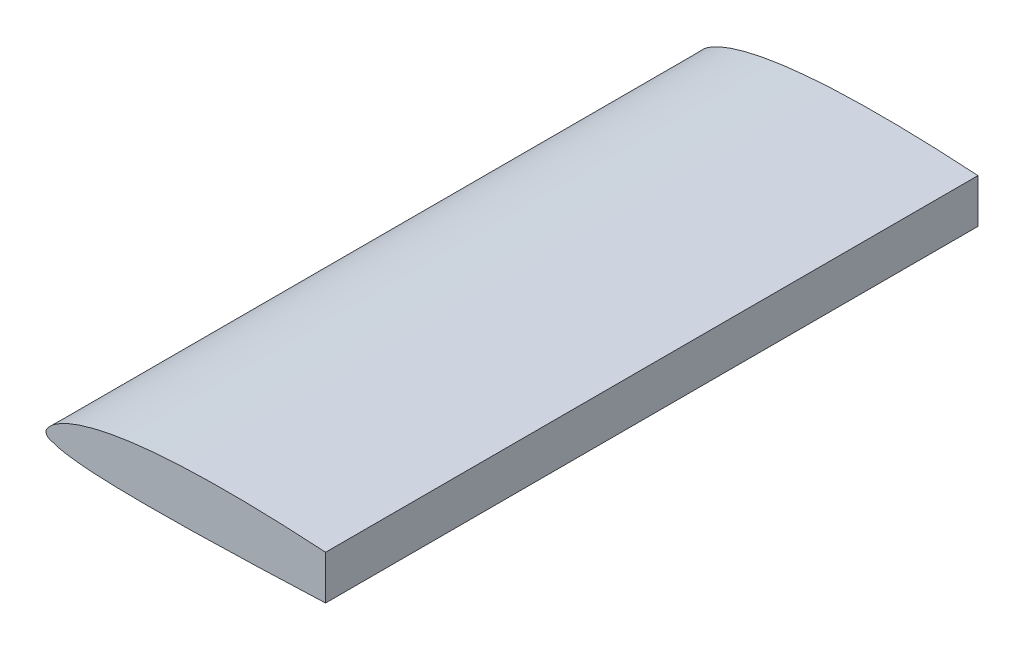
ISO-10303-21;
HEADER;
FILE_DESCRIPTION(('STEP AP214'),'2;1');
FILE_NAME('part.step','',(''),(''),'','','');
FILE_SCHEMA(('AUTOMOTIVE_DESIGN { 1 0 10303 214 1 1 1 1 }'));
ENDSEC;
DATA;
#1=APPLICATION_CONTEXT('core data for automotive mechanical design processes');
#2=APPLICATION_PROTOCOL_DEFINITION('international standard','automotive_design',2000,#1);
#3=PRODUCT_CONTEXT('',#1,'mechanical');
#4=PRODUCT('Part','Part','',(#3));
#5=PRODUCT_RELATED_PRODUCT_CATEGORY('part','',(#4));
#6=PRODUCT_DEFINITION_FORMATION('','',#4);
#7=PRODUCT_DEFINITION_CONTEXT('part definition',#1,'design');
#8=PRODUCT_DEFINITION('design','',#6,#7);
#9=PRODUCT_DEFINITION_SHAPE('','',#8);
#10=(LENGTH_UNIT() NAMED_UNIT(*) SI_UNIT(.MILLI.,.METRE.));
#11=(NAMED_UNIT(*) PLANE_ANGLE_UNIT() SI_UNIT($,.RADIAN.));
#12=(NAMED_UNIT(*) SI_UNIT($,.STERADIAN.) SOLID_ANGLE_UNIT());
#13=UNCERTAINTY_MEASURE_WITH_UNIT(LENGTH_MEASURE(1.E-05),#10,'distance_accuracy_value','');
#14=(GEOMETRIC_REPRESENTATION_CONTEXT(3) GLOBAL_UNCERTAINTY_ASSIGNED_CONTEXT((#13)) GLOBAL_UNIT_ASSIGNED_CONTEXT((#10,
#11,#12)) REPRESENTATION_CONTEXT('',''));
#15=CARTESIAN_POINT('',(0.,0.,0.));
#16=DIRECTION('',(0.,0.,1.));
#17=DIRECTION('',(1.,0.,0.));
#18=AXIS2_PLACEMENT_3D('',#15,#16,#17);
#19=CARTESIAN_POINT('',(152.4,0.,177.8));
#20=CARTESIAN_POINT('',(152.232833718495,0.0185024145844094,177.8));
#21=CARTESIAN_POINT('',(151.571843934071,0.0916625454276125,177.8));
#22=CARTESIAN_POINT('',(150.11399955714,0.283859600165364,177.8));
#23=CARTESIAN_POINT('',(147.749385864208,0.638650628689324,177.8));
#24=CARTESIAN_POINT('',(144.555943785527,1.17015700229937,177.8));
#25=CARTESIAN_POINT('',(140.615360499081,1.85909924705757,177.8));
#26=CARTESIAN_POINT('',(136.007834995224,2.67146012975516,177.8));
#27=CARTESIAN_POINT('',(130.806388018581,3.56284001663103,177.8));
#28=CARTESIAN_POINT('',(125.073826155466,4.48615477740971,177.8));
#29=CARTESIAN_POINT('',(118.8646901353,5.39775327756707,177.8));
#30=CARTESIAN_POINT('',(112.233312125261,6.27297423591478,177.8));
#31=CARTESIAN_POINT('',(105.243489487442,7.10605889156724,177.8));
#32=CARTESIAN_POINT('',(97.9696654062804,7.88931969327321,177.8));
#33=CARTESIAN_POINT('',(90.4927249927246,8.60673485806436,177.8));
#34=CARTESIAN_POINT('',(82.8952532405217,9.2406702507931,177.8));
#35=CARTESIAN_POINT('',(75.2586679023908,9.77749908015344,177.8));
#36=CARTESIAN_POINT('',(67.6629284232157,10.1988157178373,177.8));
#37=CARTESIAN_POINT('',(60.1868274986299,10.4917010195868,177.8));
#38=CARTESIAN_POINT('',(52.9059459542408,10.6450800985298,177.8));
#39=CARTESIAN_POINT('',(45.8917437129946,10.6445518064523,177.8));
#40=CARTESIAN_POINT('',(39.2106810479072,10.4862475970987,177.8));
#41=CARTESIAN_POINT('',(32.923263797137,10.1644127111138,177.8));
#42=CARTESIAN_POINT('',(27.0837008540271,9.67093972647032,177.8));
#43=CARTESIAN_POINT('',(21.737197539699,9.01650809069112,177.8));
#44=CARTESIAN_POINT('',(16.9243447592619,8.20408197388868,177.8));
#45=CARTESIAN_POINT('',(12.6762753048712,7.24977047946681,177.8));
#46=CARTESIAN_POINT('',(9.01981569255257,6.17445777095632,177.8));
#47=CARTESIAN_POINT('',(5.96569481917708,5.00201852215155,177.8));
#48=CARTESIAN_POINT('',(3.54403253695888,3.76987152616717,177.8));
#49=CARTESIAN_POINT('',(1.70483470840094,2.53149972603197,177.8));
#50=CARTESIAN_POINT('',(0.575239505776366,1.34473752883143,177.8));
#51=CARTESIAN_POINT('',(-0.170728015466049,0.203106959768801,177.8));
#52=CARTESIAN_POINT('',(0.337603285303623,-1.00177222805816,177.8));
#53=CARTESIAN_POINT('',(1.79294322608063,-1.54672679451716,177.8));
#54=CARTESIAN_POINT('',(3.794232234597,-2.17716445974196,177.8));
#55=CARTESIAN_POINT('',(6.64340020089969,-2.64392231576436,177.8));
#56=CARTESIAN_POINT('',(10.2161106536038,-3.04195363150428,177.8));
#57=CARTESIAN_POINT('',(14.5300841872538,-3.31987222771604,177.8));
#58=CARTESIAN_POINT('',(19.5339696288078,-3.49767725483492,177.8));
#59=CARTESIAN_POINT('',(25.1869220599411,-3.57763834503169,177.8));
#60=CARTESIAN_POINT('',(31.42862727455,-3.57384808178261,177.8));
#61=CARTESIAN_POINT('',(38.191948203283,-3.49658144160037,177.8));
#62=CARTESIAN_POINT('',(45.4015953170636,-3.34930898576548,177.8));
#63=CARTESIAN_POINT('',(52.9784172595709,-3.14184128811128,177.8));
#64=CARTESIAN_POINT('',(60.8386741403337,-2.88526226056694,177.8));
#65=CARTESIAN_POINT('',(68.8949884243473,-2.58793090460575,177.8));
#66=CARTESIAN_POINT('',(77.057432025165,-2.25888288701279,177.8));
#67=CARTESIAN_POINT('',(85.2350096722083,-1.90773028344113,177.8));
#68=CARTESIAN_POINT('',(93.3354268335371,-1.55016881909302,177.8));
#69=CARTESIAN_POINT('',(101.266049648543,-1.19546522084977,177.8));
#70=CARTESIAN_POINT('',(108.934170809505,-0.862411005508114,177.8));
#71=CARTESIAN_POINT('',(116.246498600348,-0.557504044589403,177.8));
#72=CARTESIAN_POINT('',(123.110150898588,-0.3069361826572,177.8));
#73=CARTESIAN_POINT('',(129.431690532645,-0.107922528146747,177.8));
#74=CARTESIAN_POINT('',(135.123521438346,0.0279744509983298,177.8));
#75=CARTESIAN_POINT('',(140.103603919286,0.108900524885163,177.8));
#76=CARTESIAN_POINT('',(144.299415419815,0.139938590331548,177.8));
#77=CARTESIAN_POINT('',(147.644768246445,0.124243060792821,177.8));
#78=CARTESIAN_POINT('',(150.083437285214,0.0865028877410205,177.8));
#79=CARTESIAN_POINT('',(151.399782071317,0.0403495604636981,177.8));
#80=CARTESIAN_POINT('',(151.898604,0.02286,177.8));
#81=B_SPLINE_CURVE_WITH_KNOTS('',3,(#19,#20,#21,#22,#23,#24,#25,#26,#27,#28,#29,#30,#31,#32,#33,
#34,#35,#36,#37,#38,#39,#40,#41,#42,#43,#44,#45,#46,#47,#48,#49,#50,#51,#52,#53,#54,#55,#56,#57,
#58,#59,#60,#61,#62,#63,#64,#65,#66,#67,#68,#69,#70,#71,#72,#73,#74,#75,#76,#77,#78,#79,#80),
.UNSPECIFIED.,.F.,.F.,(4,1,1,1,1,1,1,1,1,1,1,1,1,1,1,1,1,1,1,1,1,1,1,1,1,1,1,1,1,1,1,1,1,1,1,1,
1,1,1,1,1,1,1,1,1,1,1,1,1,1,1,1,1,1,1,1,1,1,1,4),(0.,0.00163535583425865,0.00646633693476808,
0.0142965918772176,0.0248842088552096,0.0379439925510076,0.0531941368467982,0.0703765688743697,
0.0892572179770476,0.109651763058439,0.131396199224683,0.154294670265703,0.178096902835303,
0.202530723472683,0.227328973387424,0.25222580652472,0.276966075496197,0.301296827478668,
0.324972088966137,0.347773045551505,0.369493848961825,0.389946984550237,0.40897941596321,
0.426465789850067,0.442306728816157,0.456421239565711,0.46877353813753,0.47934514980936,
0.488155641306995,0.495223141471028,0.500608247512498,0.504417035913407,0.507344225330662,
0.511892730711683,0.518766332626908,0.528062399813873,0.5397504852938,0.553781923901918,
0.570059197087642,0.588441486429501,0.608747967256935,0.630750043644814,0.654207709776473,
0.678865071069041,0.704450570233279,0.73067750330715,0.757253936726054,0.783882586633168,
0.810265561255861,0.836095192051152,0.861073222293053,0.884896986100605,0.907258357413886,
0.927856250220039,0.946394646161361,0.962618153964165,0.976286171395788,0.987192827864271,
0.995146789524168,1.),.UNSPECIFIED.);
#82=DIRECTION('',(0.,0.,-1.));
#83=VECTOR('',#82,1.);
#84=SURFACE_OF_LINEAR_EXTRUSION('',#81,#83);
#85=CARTESIAN_POINT('',(76.2000000191939,9.69855577172151,177.8));
#86=VERTEX_POINT('',#85);
#87=CARTESIAN_POINT('',(76.2,-2.29086372580625,177.8));
#88=VERTEX_POINT('',#87);
#89=EDGE_CURVE('E11',#86,#88,#81,.T.);
#90=ORIENTED_EDGE('',*,*,#89,.F.);
#91=DIRECTION('',(0.,0.,1.));
#92=VECTOR('',#91,1.);
#93=CARTESIAN_POINT('',(76.2000000191939,9.69855577172151,-0.001000000000001));
#94=LINE('',#93,#92);
#95=CARTESIAN_POINT('',(76.1999999916463,9.69855658356959,-0.00024919249397366));
#96=VERTEX_POINT('',#95);
#97=EDGE_CURVE('E73',#96,#86,#94,.T.);
#98=ORIENTED_EDGE('',*,*,#97,.F.);
#99=CARTESIAN_POINT('',(76.1999998600843,9.69855578201625,0.));
#100=CARTESIAN_POINT('',(75.8804868101471,9.71922899578278,0.));
#101=CARTESIAN_POINT('',(73.0217187451319,9.90157704520083,0.));
#102=CARTESIAN_POINT('',(67.6629284232157,10.1988157178373,0.));
#103=CARTESIAN_POINT('',(60.1868274986299,10.4917010195868,0.));
#104=CARTESIAN_POINT('',(52.9059459542408,10.6450800985298,0.));
#105=CARTESIAN_POINT('',(45.8917437129946,10.6445518064523,0.));
#106=CARTESIAN_POINT('',(39.2106810479072,10.4862475970987,0.));
#107=CARTESIAN_POINT('',(32.923263797137,10.1644127111138,0.));
#108=CARTESIAN_POINT('',(27.0837008540271,9.67093972647032,0.));
#109=CARTESIAN_POINT('',(21.737197539699,9.01650809069112,0.));
#110=CARTESIAN_POINT('',(16.9243447592619,8.20408197388868,0.));
#111=CARTESIAN_POINT('',(12.6762753048712,7.24977047946681,0.));
#112=CARTESIAN_POINT('',(9.01981569255257,6.17445777095632,0.));
#113=CARTESIAN_POINT('',(5.96569481917708,5.00201852215155,0.));
#114=CARTESIAN_POINT('',(3.54403253695888,3.76987152616717,0.));
#115=CARTESIAN_POINT('',(1.70483470840094,2.53149972603197,0.));
#116=CARTESIAN_POINT('',(0.575239505776366,1.34473752883143,0.));
#117=CARTESIAN_POINT('',(-0.170728015466049,0.203106959768801,0.));
#118=CARTESIAN_POINT('',(0.337603285303623,-1.00177222805816,0.));
#119=CARTESIAN_POINT('',(1.79294322608063,-1.54672679451716,0.));
#120=CARTESIAN_POINT('',(3.794232234597,-2.17716445974196,0.));
#121=CARTESIAN_POINT('',(6.64340020089969,-2.64392231576436,0.));
#122=CARTESIAN_POINT('',(10.2161106536038,-3.04195363150428,0.));
#123=CARTESIAN_POINT('',(14.5300841872538,-3.31987222771604,0.));
#124=CARTESIAN_POINT('',(19.5339696288078,-3.49767725483492,0.));
#125=CARTESIAN_POINT('',(25.1869220599411,-3.57763834503169,0.));
#126=CARTESIAN_POINT('',(31.42862727455,-3.57384808178261,0.));
#127=CARTESIAN_POINT('',(38.191948203283,-3.49658144160037,0.));
#128=CARTESIAN_POINT('',(45.4015953170636,-3.34930898576548,0.));
#129=CARTESIAN_POINT('',(52.9784172595709,-3.14184128811128,0.));
#130=CARTESIAN_POINT('',(60.8386741403337,-2.88526226056694,0.));
#131=CARTESIAN_POINT('',(68.6109658442729,-2.59841321895944,0.));
#132=CARTESIAN_POINT('',(73.7530967097136,-2.39203807888979,0.));
#133=CARTESIAN_POINT('',(76.2000028591815,-2.29086360758506,0.));
#134=B_SPLINE_CURVE_WITH_KNOTS('',3,(#99,#100,#101,#102,#103,#104,#105,#106,#107,#108,#109,#110,
#111,#112,#113,#114,#115,#116,#117,#118,#119,#120,#121,#122,#123,#124,#125,#126,#127,#128,#129,
#130,#131,#132,#133),.UNSPECIFIED.,.F.,.F.,(4,1,1,1,1,1,1,1,1,1,1,1,1,1,1,1,1,1,1,1,1,1,1,1,1,1,
1,1,1,1,1,1,4),(0.249112544207263,0.25222580652472,0.276966075496197,0.301296827478668,
0.324972088966137,0.347773045551505,0.369493848961825,0.389946984550237,0.40897941596321,
0.426465789850067,0.442306728816157,0.456421239565711,0.46877353813753,0.47934514980936,
0.488155641306995,0.495223141471028,0.500608247512498,0.504417035913407,0.507344225330662,
0.511892730711683,0.518766332626908,0.528062399813873,0.5397504852938,0.553781923901918,
0.570059197087642,0.588441486429501,0.608747967256935,0.630750043644814,0.654207709776473,
0.678865071069041,0.704450570233279,0.73067750330715,0.754490364317118),.UNSPECIFIED.);
#135=CARTESIAN_POINT('',(76.2000004191948,-2.29083681989652,-0.000224048710782881));
#136=VERTEX_POINT('',#135);
#137=EDGE_CURVE('E56',#96,#136,#134,.T.);
#138=ORIENTED_EDGE('',*,*,#137,.T.);
#139=DIRECTION('',(0.,0.,1.));
#140=VECTOR('',#139,1.);
#141=CARTESIAN_POINT('',(76.2,-2.29086372580625,-0.000999999999973245));
#142=LINE('',#141,#140);
#143=EDGE_CURVE('E64',#136,#88,#142,.T.);
#144=ORIENTED_EDGE('',*,*,#143,.T.);
#145=EDGE_LOOP('',(#90,#98,#138,#144));
#146=FACE_BOUND('',#145,.T.);
#147=ADVANCED_FACE('F46',(#146),#84,.F.);
#148=CARTESIAN_POINT('',(0.,0.,177.8));
#149=DIRECTION('',(0.,0.,1.));
#150=DIRECTION('',(1.,0.,0.));
#151=AXIS2_PLACEMENT_3D('',#148,#149,#150);
#152=PLANE('',#151);
#153=DIRECTION('',(0.,-1.,0.));
#154=VECTOR('',#153,1.);
#155=CARTESIAN_POINT('',(76.2,0.,177.8));
#156=LINE('',#155,#154);
#157=EDGE_CURVE('E76',#86,#88,#156,.T.);
#158=ORIENTED_EDGE('',*,*,#157,.F.);
#159=ORIENTED_EDGE('',*,*,#89,.T.);
#160=EDGE_LOOP('',(#158,#159));
#161=FACE_BOUND('',#160,.T.);
#162=ADVANCED_FACE('F83',(#161),#152,.T.);
#163=CARTESIAN_POINT('',(0.,0.,0.));
#164=DIRECTION('',(0.,0.,1.));
#165=DIRECTION('',(1.,0.,0.));
#166=AXIS2_PLACEMENT_3D('',#163,#164,#165);
#167=PLANE('',#166);
#168=ORIENTED_EDGE('',*,*,#137,.F.);
#169=DIRECTION('',(0.,1.,0.));
#170=VECTOR('',#169,1.);
#171=CARTESIAN_POINT('',(76.2,0.,0.));
#172=LINE('',#171,#170);
#173=EDGE_CURVE('E69',#96,#136,#172,.F.);
#174=ORIENTED_EDGE('',*,*,#173,.T.);
#175=EDGE_LOOP('',(#168,#174));
#176=FACE_BOUND('',#175,.T.);
#177=ADVANCED_FACE('F108',(#176),#167,.F.);
#178=CARTESIAN_POINT('',(76.2,0.,-0.00100000000002876));
#179=DIRECTION('',(-1.,0.,0.));
#180=DIRECTION('',(0.,0.,1.));
#181=AXIS2_PLACEMENT_3D('',#178,#179,#180);
#182=PLANE('',#181);
#183=ORIENTED_EDGE('',*,*,#173,.F.);
#184=ORIENTED_EDGE('',*,*,#97,.T.);
#185=ORIENTED_EDGE('',*,*,#157,.T.);
#186=ORIENTED_EDGE('',*,*,#143,.F.);
#187=EDGE_LOOP('',(#183,#184,#185,#186));
#188=FACE_BOUND('',#187,.T.);
#189=ADVANCED_FACE('F75',(#188),#182,.F.);
#190=CLOSED_SHELL('',(#147,#162,#177,#189));
#191=MANIFOLD_SOLID_BREP('B2',#190);
#192=ADVANCED_BREP_SHAPE_REPRESENTATION('',(#18,#191),#14);
#193=SHAPE_DEFINITION_REPRESENTATION(#9,#192);
ENDSEC;
END-ISO-10303-21;
